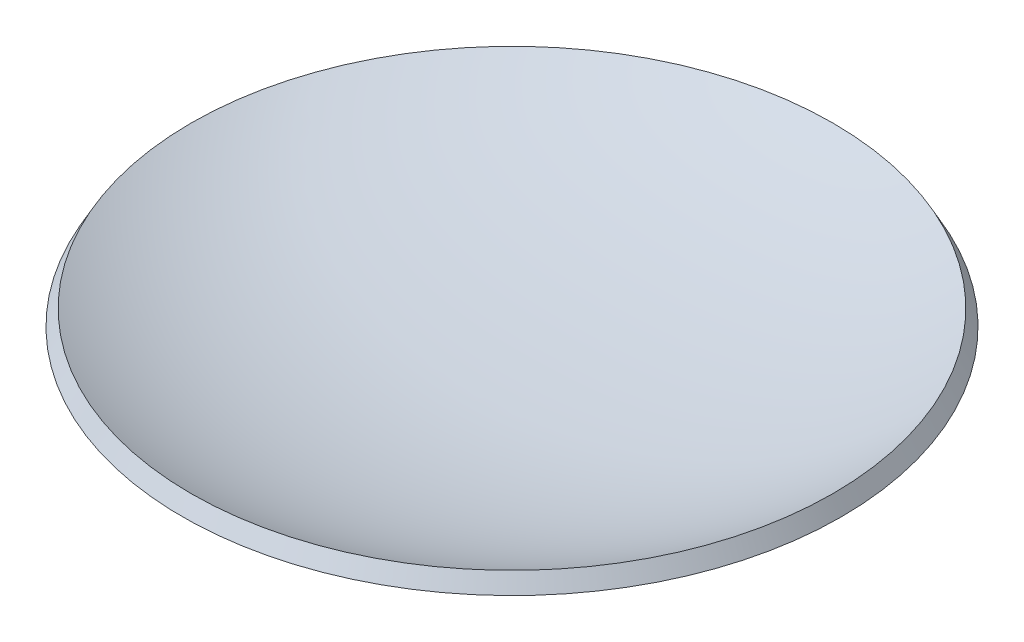
ISO-10303-21;
HEADER;
FILE_DESCRIPTION(('STEP AP214'),'2;1');
FILE_NAME('part.step','',(''),(''),'','','');
FILE_SCHEMA(('AUTOMOTIVE_DESIGN { 1 0 10303 214 1 1 1 1 }'));
ENDSEC;
DATA;
#1=APPLICATION_CONTEXT('core data for automotive mechanical design processes');
#2=APPLICATION_PROTOCOL_DEFINITION('international standard','automotive_design',2000,#1);
#3=PRODUCT_CONTEXT('',#1,'mechanical');
#4=PRODUCT('Part','Part','',(#3));
#5=PRODUCT_RELATED_PRODUCT_CATEGORY('part','',(#4));
#6=PRODUCT_DEFINITION_FORMATION('','',#4);
#7=PRODUCT_DEFINITION_CONTEXT('part definition',#1,'design');
#8=PRODUCT_DEFINITION('design','',#6,#7);
#9=PRODUCT_DEFINITION_SHAPE('','',#8);
#10=(LENGTH_UNIT() NAMED_UNIT(*) SI_UNIT(.MILLI.,.METRE.));
#11=(NAMED_UNIT(*) PLANE_ANGLE_UNIT() SI_UNIT($,.RADIAN.));
#12=(NAMED_UNIT(*) SI_UNIT($,.STERADIAN.) SOLID_ANGLE_UNIT());
#13=UNCERTAINTY_MEASURE_WITH_UNIT(LENGTH_MEASURE(1.E-05),#10,'distance_accuracy_value','');
#14=(GEOMETRIC_REPRESENTATION_CONTEXT(3) GLOBAL_UNCERTAINTY_ASSIGNED_CONTEXT((#13)) GLOBAL_UNIT_ASSIGNED_CONTEXT((#10,
#11,#12)) REPRESENTATION_CONTEXT('',''));
#15=CARTESIAN_POINT('',(0.,0.,0.));
#16=DIRECTION('',(0.,0.,1.));
#17=DIRECTION('',(1.,0.,0.));
#18=AXIS2_PLACEMENT_3D('',#15,#16,#17);
#19=CARTESIAN_POINT('',(170.8725051449,-61.94932027124,106.96));
#20=CARTESIAN_POINT('',(170.8993412229,-61.96428846094,106.96));
#21=CARTESIAN_POINT('',(172.2256156325,-62.69676556049,106.96));
#22=CARTESIAN_POINT('',(175.1339067911,-63.57654316705,106.96));
#23=CARTESIAN_POINT('',(178.2467492941,-63.8,106.96));
#24=CARTESIAN_POINT('',(179.89,-63.8,106.96));
#25=(BOUNDED_CURVE() B_SPLINE_CURVE(3,(#19,#20,#21,#22,#23,#24),.UNSPECIFIED.,.F.,
.F.) B_SPLINE_CURVE_WITH_KNOTS((4,1,1,4),(0.,0.009898597038726,0.4884903635307,1.),
.UNSPECIFIED.) CURVE() GEOMETRIC_REPRESENTATION_ITEM() RATIONAL_B_SPLINE_CURVE((1.,1.,1.,1.,1.,1.)) REPRESENTATION_ITEM(''));
#26=CARTESIAN_POINT('',(179.89,-64.45,106.96));
#27=DIRECTION('',(0.,-1.,0.));
#28=AXIS1_PLACEMENT('',#26,#27);
#29=SURFACE_OF_REVOLUTION('',#25,#28);
#30=CARTESIAN_POINT('',(179.89,-63.8,106.96));
#31=CARTESIAN_POINT('',(180.285444941521,-63.7999759582205,106.960000000165));
#32=CARTESIAN_POINT('',(180.68098472924,-63.7933138345827,106.960000000329));
#33=CARTESIAN_POINT('',(181.46717573955,-63.7646669558857,106.960000000657));
#34=CARTESIAN_POINT('',(181.857833243548,-63.7428500499084,106.960000000819));
#35=CARTESIAN_POINT('',(182.63353771244,-63.6822758474327,106.960000001142));
#36=CARTESIAN_POINT('',(183.018599049428,-63.643707967333,106.960000001303));
#37=CARTESIAN_POINT('',(183.782346888374,-63.5479395784258,106.960000001621));
#38=CARTESIAN_POINT('',(184.161057857754,-63.4909391381945,106.960000001778));
#39=CARTESIAN_POINT('',(184.724973409733,-63.390108894053,106.960000002013));
#40=CARTESIAN_POINT('',(184.9115952515,-63.3540992410419,106.960000002091));
#41=CARTESIAN_POINT('',(185.282914775382,-63.2765720758821,106.960000002245));
#42=CARTESIAN_POINT('',(185.46761718806,-63.2350774440914,106.960000002322));
#43=CARTESIAN_POINT('',(185.834931626944,-63.1459535846126,106.960000002475));
#44=CARTESIAN_POINT('',(186.017548382861,-63.0983439395089,106.960000002551));
#45=CARTESIAN_POINT('',(186.380539432346,-62.9963987963028,106.960000002702));
#46=CARTESIAN_POINT('',(186.56091724708,-62.9420758934768,106.960000002777));
#47=CARTESIAN_POINT('',(186.919275923233,-62.8261074364488,106.960000002926));
#48=CARTESIAN_POINT('',(187.097257218884,-62.7644632292478,106.960000003001));
#49=CARTESIAN_POINT('',(187.450671345517,-62.633265027404,106.960000003148));
#50=CARTESIAN_POINT('',(187.626098727323,-62.5636963110616,106.960000003221));
#51=CARTESIAN_POINT('',(187.974255769924,-62.416055728483,106.960000003366));
#52=CARTESIAN_POINT('',(188.146970266576,-62.3379479854211,106.960000003438));
#53=CARTESIAN_POINT('',(188.489557522384,-62.1726812852993,106.96000000358));
#54=CARTESIAN_POINT('',(188.659400522388,-62.0854606966438,106.960000003651));
#55=CARTESIAN_POINT('',(188.826869698894,-61.9938494788257,106.960000003721));
#56=B_SPLINE_CURVE_WITH_KNOTS('',3,(#30,#31,#32,#33,#34,#35,#36,#37,#38,#39,#40,#41,#42,#43,#44,
#45,#46,#47,#48,#49,#50,#51,#52,#53,#54,#55),.UNSPECIFIED.,.F.,.F.,(4,2,2,2,2,2,2,2,2,2,2,2,4),
(0.,1.18642230047079,2.35990946286702,3.52045914925429,4.6688126858464,5.23893759602753,
5.80675518330521,6.37279774106844,6.9377939808756,7.50268643112108,8.06864596890709,
8.63708209108763,9.20964769130286),.UNSPECIFIED.);
#57=CARTESIAN_POINT('',(179.89,-63.8,106.96));
#58=VERTEX_POINT('',#57);
#59=CARTESIAN_POINT('',(188.826869698893,-61.9938494788198,106.960000000823));
#60=VERTEX_POINT('',#59);
#61=EDGE_CURVE('E40',#58,#60,#56,.T.);
#62=ORIENTED_EDGE('',*,*,#61,.T.);
#63=CARTESIAN_POINT('',(179.89,-61.9938494788167,106.96));
#64=DIRECTION('',(0.,-1.,0.));
#65=DIRECTION('',(-1.,0.,0.));
#66=AXIS2_PLACEMENT_3D('',#63,#64,#65);
#67=CIRCLE('',#66,8.93686969888766);
#68=EDGE_CURVE('E29',#60,#60,#67,.T.);
#69=ORIENTED_EDGE('',*,*,#68,.F.);
#70=ORIENTED_EDGE('',*,*,#61,.F.);
#71=EDGE_LOOP('',(#62,#69,#70));
#72=FACE_BOUND('',#71,.T.);
#73=ADVANCED_FACE('F17',(#72),#29,.F.);
#74=CARTESIAN_POINT('',(179.89,-62.4325363731819,106.96));
#75=DIRECTION('',(0.,-1.,0.));
#76=DIRECTION('',(0.,0.,-1.));
#77=AXIS2_PLACEMENT_3D('',#74,#75,#76);
#78=CONICAL_SURFACE('',#77,9.17677344772749,0.500435291822458);
#79=CARTESIAN_POINT('',(179.89,-62.432536373155,106.96));
#80=DIRECTION('',(0.,-1.,0.));
#81=DIRECTION('',(-1.,0.,0.));
#82=AXIS2_PLACEMENT_3D('',#79,#80,#81);
#83=CIRCLE('',#82,9.17677344774098);
#84=CARTESIAN_POINT('',(170.713226552259,-62.432536373155,106.96));
#85=VERTEX_POINT('',#84);
#86=EDGE_CURVE('E11',#85,#85,#83,.F.);
#87=ORIENTED_EDGE('',*,*,#86,.T.);
#88=EDGE_LOOP('',(#87));
#89=FACE_BOUND('',#88,.T.);
#90=ORIENTED_EDGE('',*,*,#68,.T.);
#91=EDGE_LOOP('',(#90));
#92=FACE_BOUND('',#91,.T.);
#93=ADVANCED_FACE('F69',(#89,#92),#78,.T.);
#94=CARTESIAN_POINT('',(170.630406874,-62.38680415269,106.96));
#95=CARTESIAN_POINT('',(170.6579789668,-62.40217679585,106.96));
#96=CARTESIAN_POINT('',(172.0438602887,-63.16742251554,106.96));
#97=CARTESIAN_POINT('',(175.0580376281,-64.07518215874,106.96));
#98=CARTESIAN_POINT('',(178.2235174918,-64.3,106.96));
#99=CARTESIAN_POINT('',(179.89,-64.3,106.96));
#100=(BOUNDED_CURVE() B_SPLINE_CURVE(3,(#94,#95,#96,#97,#98,#99),.UNSPECIFIED.,.F.,
.F.) B_SPLINE_CURVE_WITH_KNOTS((4,1,1,4),(0.,0.009728947929566,0.488402719472,1.),
.UNSPECIFIED.) CURVE() GEOMETRIC_REPRESENTATION_ITEM() RATIONAL_B_SPLINE_CURVE((1.,1.,1.,1.,1.,1.)) REPRESENTATION_ITEM(''));
#101=CARTESIAN_POINT('',(179.89,-64.45,106.96));
#102=DIRECTION('',(0.,-1.,0.));
#103=AXIS1_PLACEMENT('',#101,#102);
#104=SURFACE_OF_REVOLUTION('',#100,#103);
#105=CARTESIAN_POINT('',(179.89,-64.3,106.96));
#106=VERTEX_POINT('',#105);
#107=VERTEX_LOOP('',#106);
#108=FACE_BOUND('',#107,.T.);
#109=ORIENTED_EDGE('',*,*,#86,.F.);
#110=EDGE_LOOP('',(#109));
#111=FACE_BOUND('',#110,.T.);
#112=ADVANCED_FACE('F67',(#108,#111),#104,.T.);
#113=CLOSED_SHELL('',(#73,#93,#112));
#114=MANIFOLD_SOLID_BREP('B1',#113);
#115=ADVANCED_BREP_SHAPE_REPRESENTATION('',(#18,#114),#14);
#116=SHAPE_DEFINITION_REPRESENTATION(#9,#115);
ENDSEC;
END-ISO-10303-21;
